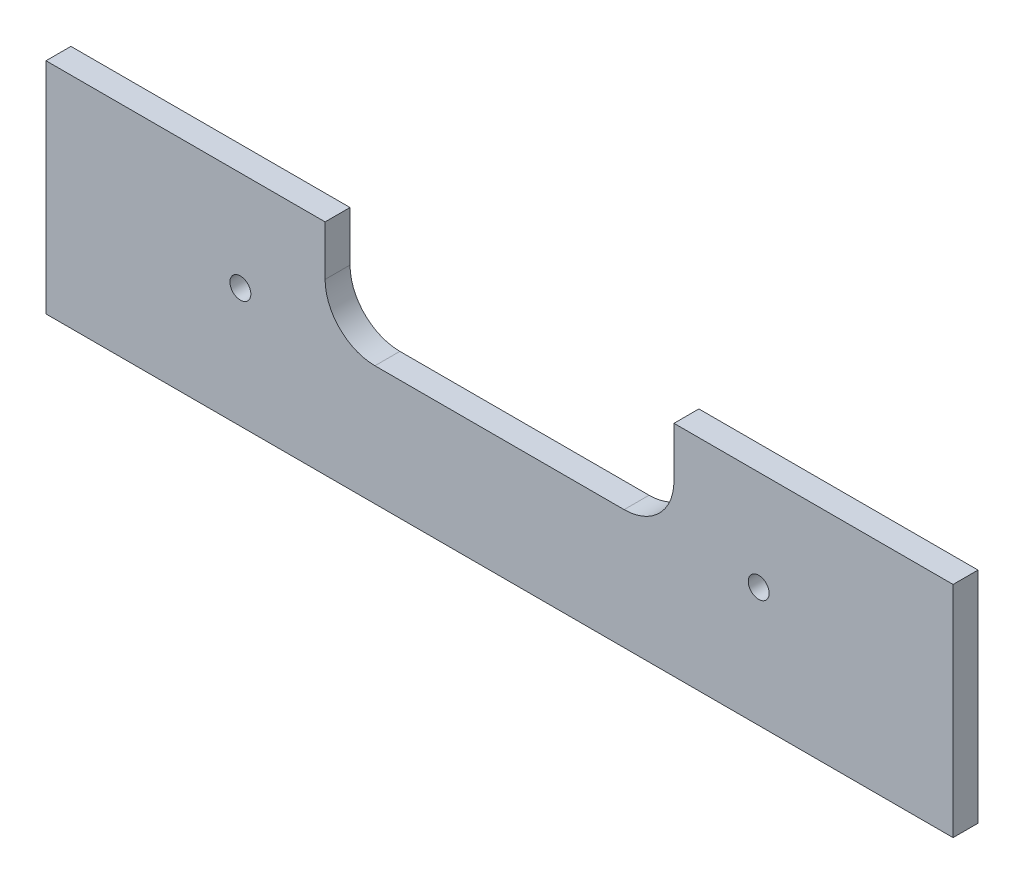
ISO-10303-21;
HEADER;
FILE_DESCRIPTION(('STEP AP214'),'2;1');
FILE_NAME('part.step','',(''),(''),'','','');
FILE_SCHEMA(('AUTOMOTIVE_DESIGN { 1 0 10303 214 1 1 1 1 }'));
ENDSEC;
DATA;
#1=APPLICATION_CONTEXT('core data for automotive mechanical design processes');
#2=APPLICATION_PROTOCOL_DEFINITION('international standard','automotive_design',2000,#1);
#3=PRODUCT_CONTEXT('',#1,'mechanical');
#4=PRODUCT('Part','Part','',(#3));
#5=PRODUCT_RELATED_PRODUCT_CATEGORY('part','',(#4));
#6=PRODUCT_DEFINITION_FORMATION('','',#4);
#7=PRODUCT_DEFINITION_CONTEXT('part definition',#1,'design');
#8=PRODUCT_DEFINITION('design','',#6,#7);
#9=PRODUCT_DEFINITION_SHAPE('','',#8);
#10=(LENGTH_UNIT() NAMED_UNIT(*) SI_UNIT(.MILLI.,.METRE.));
#11=(NAMED_UNIT(*) PLANE_ANGLE_UNIT() SI_UNIT($,.RADIAN.));
#12=(NAMED_UNIT(*) SI_UNIT($,.STERADIAN.) SOLID_ANGLE_UNIT());
#13=UNCERTAINTY_MEASURE_WITH_UNIT(LENGTH_MEASURE(1.E-05),#10,'distance_accuracy_value','');
#14=(GEOMETRIC_REPRESENTATION_CONTEXT(3) GLOBAL_UNCERTAINTY_ASSIGNED_CONTEXT((#13)) GLOBAL_UNIT_ASSIGNED_CONTEXT((#10,
#11,#12)) REPRESENTATION_CONTEXT('',''));
#15=CARTESIAN_POINT('',(0.,0.,0.));
#16=DIRECTION('',(0.,0.,1.));
#17=DIRECTION('',(1.,0.,0.));
#18=AXIS2_PLACEMENT_3D('',#15,#16,#17);
#19=CARTESIAN_POINT('',(91.,25.,5.));
#20=DIRECTION('',(0.,-1.,0.));
#21=DIRECTION('',(1.,0.,0.));
#22=AXIS2_PLACEMENT_3D('',#19,#20,#21);
#23=PLANE('',#22);
#24=DIRECTION('',(-1.,0.,0.));
#25=VECTOR('',#24,1.);
#26=CARTESIAN_POINT('',(91.,25.,5.));
#27=LINE('',#26,#25);
#28=CARTESIAN_POINT('',(-35.,25.,5.));
#29=VERTEX_POINT('',#28);
#30=CARTESIAN_POINT('',(-91.,25.,5.));
#31=VERTEX_POINT('',#30);
#32=EDGE_CURVE('E141',#29,#31,#27,.T.);
#33=ORIENTED_EDGE('',*,*,#32,.F.);
#34=DIRECTION('',(0.,0.,1.));
#35=VECTOR('',#34,1.);
#36=CARTESIAN_POINT('',(-35.,25.,-5.));
#37=LINE('',#36,#35);
#38=CARTESIAN_POINT('',(-35.,25.,0.));
#39=VERTEX_POINT('',#38);
#40=EDGE_CURVE('E131',#39,#29,#37,.T.);
#41=ORIENTED_EDGE('',*,*,#40,.F.);
#42=DIRECTION('',(-1.,0.,0.));
#43=VECTOR('',#42,1.);
#44=CARTESIAN_POINT('',(91.,25.,0.));
#45=LINE('',#44,#43);
#46=CARTESIAN_POINT('',(-91.,25.,0.));
#47=VERTEX_POINT('',#46);
#48=EDGE_CURVE('E155',#39,#47,#45,.T.);
#49=ORIENTED_EDGE('',*,*,#48,.T.);
#50=DIRECTION('',(0.,0.,-1.));
#51=VECTOR('',#50,1.);
#52=CARTESIAN_POINT('',(-91.,25.,5.));
#53=LINE('',#52,#51);
#54=EDGE_CURVE('E140',#31,#47,#53,.T.);
#55=ORIENTED_EDGE('',*,*,#54,.F.);
#56=EDGE_LOOP('',(#33,#41,#49,#55));
#57=FACE_BOUND('',#56,.T.);
#58=ADVANCED_FACE('F38',(#57),#23,.F.);
#59=CARTESIAN_POINT('',(-91.,-25.,5.));
#60=DIRECTION('',(1.,0.,0.));
#61=DIRECTION('',(0.,0.,-1.));
#62=AXIS2_PLACEMENT_3D('',#59,#60,#61);
#63=PLANE('',#62);
#64=DIRECTION('',(0.,-1.,0.));
#65=VECTOR('',#64,1.);
#66=CARTESIAN_POINT('',(-91.,-25.,0.));
#67=LINE('',#66,#65);
#68=CARTESIAN_POINT('',(-91.,-19.,0.));
#69=VERTEX_POINT('',#68);
#70=EDGE_CURVE('E149',#47,#69,#67,.T.);
#71=ORIENTED_EDGE('',*,*,#70,.T.);
#72=DIRECTION('',(0.,0.,1.));
#73=VECTOR('',#72,1.);
#74=CARTESIAN_POINT('',(-91.,-19.,-5.));
#75=LINE('',#74,#73);
#76=CARTESIAN_POINT('',(-91.,-19.,5.));
#77=VERTEX_POINT('',#76);
#78=EDGE_CURVE('E235',#69,#77,#75,.T.);
#79=ORIENTED_EDGE('',*,*,#78,.T.);
#80=DIRECTION('',(0.,-1.,0.));
#81=VECTOR('',#80,1.);
#82=CARTESIAN_POINT('',(-91.,-25.,5.));
#83=LINE('',#82,#81);
#84=EDGE_CURVE('E156',#31,#77,#83,.T.);
#85=ORIENTED_EDGE('',*,*,#84,.F.);
#86=ORIENTED_EDGE('',*,*,#54,.T.);
#87=EDGE_LOOP('',(#71,#79,#85,#86));
#88=FACE_BOUND('',#87,.T.);
#89=ADVANCED_FACE('F202',(#88),#63,.F.);
#90=CARTESIAN_POINT('',(91.,-25.,5.));
#91=DIRECTION('',(-1.,0.,0.));
#92=DIRECTION('',(0.,0.,1.));
#93=AXIS2_PLACEMENT_3D('',#90,#91,#92);
#94=PLANE('',#93);
#95=DIRECTION('',(0.,1.,0.));
#96=VECTOR('',#95,1.);
#97=CARTESIAN_POINT('',(91.,-25.,5.));
#98=LINE('',#97,#96);
#99=CARTESIAN_POINT('',(91.,-19.,5.));
#100=VERTEX_POINT('',#99);
#101=CARTESIAN_POINT('',(91.,25.,5.));
#102=VERTEX_POINT('',#101);
#103=EDGE_CURVE('E138',#100,#102,#98,.T.);
#104=ORIENTED_EDGE('',*,*,#103,.F.);
#105=DIRECTION('',(0.,0.,1.));
#106=VECTOR('',#105,1.);
#107=CARTESIAN_POINT('',(91.,-19.,-5.));
#108=LINE('',#107,#106);
#109=CARTESIAN_POINT('',(91.,-19.,0.));
#110=VERTEX_POINT('',#109);
#111=EDGE_CURVE('E225',#110,#100,#108,.T.);
#112=ORIENTED_EDGE('',*,*,#111,.F.);
#113=DIRECTION('',(0.,1.,0.));
#114=VECTOR('',#113,1.);
#115=CARTESIAN_POINT('',(91.,-25.,0.));
#116=LINE('',#115,#114);
#117=CARTESIAN_POINT('',(91.,25.,0.));
#118=VERTEX_POINT('',#117);
#119=EDGE_CURVE('E152',#110,#118,#116,.T.);
#120=ORIENTED_EDGE('',*,*,#119,.T.);
#121=DIRECTION('',(0.,0.,-1.));
#122=VECTOR('',#121,1.);
#123=CARTESIAN_POINT('',(91.,25.,5.));
#124=LINE('',#123,#122);
#125=EDGE_CURVE('E144',#102,#118,#124,.T.);
#126=ORIENTED_EDGE('',*,*,#125,.F.);
#127=EDGE_LOOP('',(#104,#112,#120,#126));
#128=FACE_BOUND('',#127,.T.);
#129=ADVANCED_FACE('F208',(#128),#94,.F.);
#130=CARTESIAN_POINT('',(35.,25.,0.));
#131=VERTEX_POINT('',#130);
#132=EDGE_CURVE('E130',#118,#131,#45,.T.);
#133=ORIENTED_EDGE('',*,*,#132,.T.);
#134=DIRECTION('',(0.,0.,1.));
#135=VECTOR('',#134,1.);
#136=CARTESIAN_POINT('',(35.,25.,-5.));
#137=LINE('',#136,#135);
#138=CARTESIAN_POINT('',(35.,25.,5.));
#139=VERTEX_POINT('',#138);
#140=EDGE_CURVE('E117',#131,#139,#137,.T.);
#141=ORIENTED_EDGE('',*,*,#140,.T.);
#142=EDGE_CURVE('E128',#102,#139,#27,.T.);
#143=ORIENTED_EDGE('',*,*,#142,.F.);
#144=ORIENTED_EDGE('',*,*,#125,.T.);
#145=EDGE_LOOP('',(#133,#141,#143,#144));
#146=FACE_BOUND('',#145,.T.);
#147=ADVANCED_FACE('F126',(#146),#23,.F.);
#148=CARTESIAN_POINT('',(0.,0.,5.));
#149=DIRECTION('',(0.,0.,1.));
#150=DIRECTION('',(1.,0.,0.));
#151=AXIS2_PLACEMENT_3D('',#148,#149,#150);
#152=PLANE('',#151);
#153=DIRECTION('',(0.,-1.,0.));
#154=VECTOR('',#153,1.);
#155=CARTESIAN_POINT('',(-35.,25.,5.));
#156=LINE('',#155,#154);
#157=CARTESIAN_POINT('',(-35.,15.,5.));
#158=VERTEX_POINT('',#157);
#159=EDGE_CURVE('E193',#29,#158,#156,.T.);
#160=ORIENTED_EDGE('',*,*,#159,.F.);
#161=ORIENTED_EDGE('',*,*,#32,.T.);
#162=ORIENTED_EDGE('',*,*,#84,.T.);
#163=DIRECTION('',(-1.,0.,0.));
#164=VECTOR('',#163,1.);
#165=CARTESIAN_POINT('',(-91.,-19.,5.));
#166=LINE('',#165,#164);
#167=EDGE_CURVE('E236',#100,#77,#166,.T.);
#168=ORIENTED_EDGE('',*,*,#167,.F.);
#169=ORIENTED_EDGE('',*,*,#103,.T.);
#170=ORIENTED_EDGE('',*,*,#142,.T.);
#171=DIRECTION('',(0.,1.,0.));
#172=VECTOR('',#171,1.);
#173=CARTESIAN_POINT('',(35.,25.,5.));
#174=LINE('',#173,#172);
#175=CARTESIAN_POINT('',(35.,15.,5.));
#176=VERTEX_POINT('',#175);
#177=EDGE_CURVE('E114',#176,#139,#174,.T.);
#178=ORIENTED_EDGE('',*,*,#177,.F.);
#179=CARTESIAN_POINT('',(25.,15.,5.));
#180=DIRECTION('',(0.,0.,1.));
#181=DIRECTION('',(1.,0.,0.));
#182=AXIS2_PLACEMENT_3D('',#179,#180,#181);
#183=CIRCLE('',#182,10.);
#184=CARTESIAN_POINT('',(25.,5.00000000000001,5.));
#185=VERTEX_POINT('',#184);
#186=EDGE_CURVE('E46',#176,#185,#183,.F.);
#187=ORIENTED_EDGE('',*,*,#186,.T.);
#188=DIRECTION('',(1.,0.,0.));
#189=VECTOR('',#188,1.);
#190=CARTESIAN_POINT('',(-35.,5.00000000000001,5.));
#191=LINE('',#190,#189);
#192=CARTESIAN_POINT('',(-25.,5.00000000000001,5.));
#193=VERTEX_POINT('',#192);
#194=EDGE_CURVE('E122',#193,#185,#191,.T.);
#195=ORIENTED_EDGE('',*,*,#194,.F.);
#196=CARTESIAN_POINT('',(-25.,15.,5.));
#197=DIRECTION('',(0.,0.,1.));
#198=DIRECTION('',(1.,0.,0.));
#199=AXIS2_PLACEMENT_3D('',#196,#197,#198);
#200=CIRCLE('',#199,10.);
#201=EDGE_CURVE('E184',#193,#158,#200,.F.);
#202=ORIENTED_EDGE('',*,*,#201,.T.);
#203=EDGE_LOOP('',(#160,#161,#162,#168,#169,#170,#178,#187,#195,#202));
#204=FACE_BOUND('',#203,.T.);
#205=CARTESIAN_POINT('',(-52.,5.00000000000001,5.));
#206=DIRECTION('',(0.,0.,1.));
#207=DIRECTION('',(1.,0.,0.));
#208=AXIS2_PLACEMENT_3D('',#205,#206,#207);
#209=CIRCLE('',#208,2.1);
#210=CARTESIAN_POINT('',(-49.9,5.00000000000001,5.));
#211=VERTEX_POINT('',#210);
#212=EDGE_CURVE('E166',#211,#211,#209,.T.);
#213=ORIENTED_EDGE('',*,*,#212,.F.);
#214=EDGE_LOOP('',(#213));
#215=FACE_BOUND('',#214,.T.);
#216=CARTESIAN_POINT('',(52.,5.00000000000001,5.));
#217=DIRECTION('',(0.,0.,1.));
#218=DIRECTION('',(1.,0.,0.));
#219=AXIS2_PLACEMENT_3D('',#216,#217,#218);
#220=CIRCLE('',#219,2.1);
#221=CARTESIAN_POINT('',(54.1,5.00000000000001,5.));
#222=VERTEX_POINT('',#221);
#223=EDGE_CURVE('E162',#222,#222,#220,.T.);
#224=ORIENTED_EDGE('',*,*,#223,.F.);
#225=EDGE_LOOP('',(#224));
#226=FACE_BOUND('',#225,.T.);
#227=ADVANCED_FACE('F134',(#204,#215,#226),#152,.T.);
#228=CARTESIAN_POINT('',(0.,0.,0.));
#229=DIRECTION('',(0.,0.,1.));
#230=DIRECTION('',(1.,0.,0.));
#231=AXIS2_PLACEMENT_3D('',#228,#229,#230);
#232=PLANE('',#231);
#233=ORIENTED_EDGE('',*,*,#48,.F.);
#234=DIRECTION('',(0.,-1.,0.));
#235=VECTOR('',#234,1.);
#236=CARTESIAN_POINT('',(-35.,0.,0.));
#237=LINE('',#236,#235);
#238=CARTESIAN_POINT('',(-35.,15.,0.));
#239=VERTEX_POINT('',#238);
#240=EDGE_CURVE('E173',#39,#239,#237,.T.);
#241=ORIENTED_EDGE('',*,*,#240,.T.);
#242=CARTESIAN_POINT('',(-25.,15.,0.));
#243=DIRECTION('',(0.,0.,1.));
#244=DIRECTION('',(1.,0.,0.));
#245=AXIS2_PLACEMENT_3D('',#242,#243,#244);
#246=CIRCLE('',#245,10.);
#247=CARTESIAN_POINT('',(-25.,5.00000000000001,0.));
#248=VERTEX_POINT('',#247);
#249=EDGE_CURVE('E186',#239,#248,#246,.T.);
#250=ORIENTED_EDGE('',*,*,#249,.T.);
#251=DIRECTION('',(1.,0.,0.));
#252=VECTOR('',#251,1.);
#253=CARTESIAN_POINT('',(0.,5.00000000000001,0.));
#254=LINE('',#253,#252);
#255=CARTESIAN_POINT('',(25.,5.00000000000001,0.));
#256=VERTEX_POINT('',#255);
#257=EDGE_CURVE('E169',#248,#256,#254,.T.);
#258=ORIENTED_EDGE('',*,*,#257,.T.);
#259=CARTESIAN_POINT('',(25.,15.,0.));
#260=DIRECTION('',(0.,0.,1.));
#261=DIRECTION('',(1.,0.,0.));
#262=AXIS2_PLACEMENT_3D('',#259,#260,#261);
#263=CIRCLE('',#262,10.);
#264=CARTESIAN_POINT('',(35.,15.,0.));
#265=VERTEX_POINT('',#264);
#266=EDGE_CURVE('E11',#256,#265,#263,.T.);
#267=ORIENTED_EDGE('',*,*,#266,.T.);
#268=DIRECTION('',(0.,1.,0.));
#269=VECTOR('',#268,1.);
#270=CARTESIAN_POINT('',(35.,0.,0.));
#271=LINE('',#270,#269);
#272=EDGE_CURVE('E171',#265,#131,#271,.T.);
#273=ORIENTED_EDGE('',*,*,#272,.T.);
#274=ORIENTED_EDGE('',*,*,#132,.F.);
#275=ORIENTED_EDGE('',*,*,#119,.F.);
#276=DIRECTION('',(-1.,0.,0.));
#277=VECTOR('',#276,1.);
#278=CARTESIAN_POINT('',(0.,-19.,0.));
#279=LINE('',#278,#277);
#280=EDGE_CURVE('E159',#110,#69,#279,.T.);
#281=ORIENTED_EDGE('',*,*,#280,.T.);
#282=ORIENTED_EDGE('',*,*,#70,.F.);
#283=EDGE_LOOP('',(#233,#241,#250,#258,#267,#273,#274,#275,#281,#282));
#284=FACE_BOUND('',#283,.T.);
#285=CARTESIAN_POINT('',(-52.,5.00000000000001,0.));
#286=DIRECTION('',(0.,0.,1.));
#287=DIRECTION('',(1.,0.,0.));
#288=AXIS2_PLACEMENT_3D('',#285,#286,#287);
#289=CIRCLE('',#288,2.1);
#290=CARTESIAN_POINT('',(-49.9,5.00000000000001,0.));
#291=VERTEX_POINT('',#290);
#292=EDGE_CURVE('E163',#291,#291,#289,.T.);
#293=ORIENTED_EDGE('',*,*,#292,.T.);
#294=EDGE_LOOP('',(#293));
#295=FACE_BOUND('',#294,.T.);
#296=CARTESIAN_POINT('',(52.,5.00000000000001,0.));
#297=DIRECTION('',(0.,0.,1.));
#298=DIRECTION('',(1.,0.,0.));
#299=AXIS2_PLACEMENT_3D('',#296,#297,#298);
#300=CIRCLE('',#299,2.1);
#301=CARTESIAN_POINT('',(54.1,5.00000000000001,0.));
#302=VERTEX_POINT('',#301);
#303=EDGE_CURVE('E153',#302,#302,#300,.T.);
#304=ORIENTED_EDGE('',*,*,#303,.T.);
#305=EDGE_LOOP('',(#304));
#306=FACE_BOUND('',#305,.T.);
#307=ADVANCED_FACE('F219',(#284,#295,#306),#232,.F.);
#308=CARTESIAN_POINT('',(52.,5.00000000000001,5.));
#309=DIRECTION('',(0.,0.,1.));
#310=DIRECTION('',(1.,0.,0.));
#311=AXIS2_PLACEMENT_3D('',#308,#309,#310);
#312=CYLINDRICAL_SURFACE('',#311,2.1);
#313=ORIENTED_EDGE('',*,*,#223,.T.);
#314=EDGE_LOOP('',(#313));
#315=FACE_BOUND('',#314,.T.);
#316=ORIENTED_EDGE('',*,*,#303,.F.);
#317=EDGE_LOOP('',(#316));
#318=FACE_BOUND('',#317,.T.);
#319=ADVANCED_FACE('F261',(#315,#318),#312,.F.);
#320=CARTESIAN_POINT('',(-52.,5.00000000000001,5.));
#321=DIRECTION('',(0.,0.,1.));
#322=DIRECTION('',(1.,0.,0.));
#323=AXIS2_PLACEMENT_3D('',#320,#321,#322);
#324=CYLINDRICAL_SURFACE('',#323,2.1);
#325=ORIENTED_EDGE('',*,*,#212,.T.);
#326=EDGE_LOOP('',(#325));
#327=FACE_BOUND('',#326,.T.);
#328=ORIENTED_EDGE('',*,*,#292,.F.);
#329=EDGE_LOOP('',(#328));
#330=FACE_BOUND('',#329,.T.);
#331=ADVANCED_FACE('F254',(#327,#330),#324,.F.);
#332=CARTESIAN_POINT('',(-91.,-19.,-5.));
#333=DIRECTION('',(0.,1.,0.));
#334=DIRECTION('',(0.,0.,1.));
#335=AXIS2_PLACEMENT_3D('',#332,#333,#334);
#336=PLANE('',#335);
#337=ORIENTED_EDGE('',*,*,#111,.T.);
#338=ORIENTED_EDGE('',*,*,#167,.T.);
#339=ORIENTED_EDGE('',*,*,#78,.F.);
#340=ORIENTED_EDGE('',*,*,#280,.F.);
#341=EDGE_LOOP('',(#337,#338,#339,#340));
#342=FACE_BOUND('',#341,.T.);
#343=ADVANCED_FACE('F252',(#342),#336,.F.);
#344=CARTESIAN_POINT('',(-35.,25.,-5.));
#345=DIRECTION('',(-1.,0.,0.));
#346=DIRECTION('',(0.,0.,1.));
#347=AXIS2_PLACEMENT_3D('',#344,#345,#346);
#348=PLANE('',#347);
#349=ORIENTED_EDGE('',*,*,#159,.T.);
#350=DIRECTION('',(0.,0.,1.));
#351=VECTOR('',#350,1.);
#352=CARTESIAN_POINT('',(-35.,15.,0.));
#353=LINE('',#352,#351);
#354=EDGE_CURVE('E181',#158,#239,#353,.F.);
#355=ORIENTED_EDGE('',*,*,#354,.T.);
#356=ORIENTED_EDGE('',*,*,#240,.F.);
#357=ORIENTED_EDGE('',*,*,#40,.T.);
#358=EDGE_LOOP('',(#349,#355,#356,#357));
#359=FACE_BOUND('',#358,.T.);
#360=ADVANCED_FACE('F244',(#359),#348,.F.);
#361=CARTESIAN_POINT('',(35.,25.,-5.));
#362=DIRECTION('',(1.,0.,0.));
#363=DIRECTION('',(0.,0.,-1.));
#364=AXIS2_PLACEMENT_3D('',#361,#362,#363);
#365=PLANE('',#364);
#366=ORIENTED_EDGE('',*,*,#272,.F.);
#367=DIRECTION('',(0.,0.,1.));
#368=VECTOR('',#367,1.);
#369=CARTESIAN_POINT('',(35.,15.,5.));
#370=LINE('',#369,#368);
#371=EDGE_CURVE('E119',#265,#176,#370,.T.);
#372=ORIENTED_EDGE('',*,*,#371,.T.);
#373=ORIENTED_EDGE('',*,*,#177,.T.);
#374=ORIENTED_EDGE('',*,*,#140,.F.);
#375=EDGE_LOOP('',(#366,#372,#373,#374));
#376=FACE_BOUND('',#375,.T.);
#377=ADVANCED_FACE('F116',(#376),#365,.F.);
#378=CARTESIAN_POINT('',(-35.,5.00000000000001,-5.));
#379=DIRECTION('',(0.,-1.,0.));
#380=DIRECTION('',(0.,0.,-1.));
#381=AXIS2_PLACEMENT_3D('',#378,#379,#380);
#382=PLANE('',#381);
#383=ORIENTED_EDGE('',*,*,#257,.F.);
#384=DIRECTION('',(0.,0.,1.));
#385=VECTOR('',#384,1.);
#386=CARTESIAN_POINT('',(-25.,5.00000000000001,5.));
#387=LINE('',#386,#385);
#388=EDGE_CURVE('E178',#248,#193,#387,.T.);
#389=ORIENTED_EDGE('',*,*,#388,.T.);
#390=ORIENTED_EDGE('',*,*,#194,.T.);
#391=DIRECTION('',(0.,0.,1.));
#392=VECTOR('',#391,1.);
#393=CARTESIAN_POINT('',(25.,5.00000000000001,0.));
#394=LINE('',#393,#392);
#395=EDGE_CURVE('E176',#185,#256,#394,.F.);
#396=ORIENTED_EDGE('',*,*,#395,.T.);
#397=EDGE_LOOP('',(#383,#389,#390,#396));
#398=FACE_BOUND('',#397,.T.);
#399=ADVANCED_FACE('F191',(#398),#382,.F.);
#400=CARTESIAN_POINT('',(-25.,15.,-5.));
#401=DIRECTION('',(0.,0.,-1.));
#402=DIRECTION('',(-1.,0.,0.));
#403=AXIS2_PLACEMENT_3D('',#400,#401,#402);
#404=CYLINDRICAL_SURFACE('',#403,10.);
#405=ORIENTED_EDGE('',*,*,#249,.F.);
#406=ORIENTED_EDGE('',*,*,#354,.F.);
#407=ORIENTED_EDGE('',*,*,#201,.F.);
#408=ORIENTED_EDGE('',*,*,#388,.F.);
#409=EDGE_LOOP('',(#405,#406,#407,#408));
#410=FACE_BOUND('',#409,.T.);
#411=ADVANCED_FACE('F196',(#410),#404,.F.);
#412=CARTESIAN_POINT('',(25.,15.,-5.));
#413=DIRECTION('',(0.,0.,-1.));
#414=DIRECTION('',(-1.,0.,0.));
#415=AXIS2_PLACEMENT_3D('',#412,#413,#414);
#416=CYLINDRICAL_SURFACE('',#415,10.);
#417=ORIENTED_EDGE('',*,*,#266,.F.);
#418=ORIENTED_EDGE('',*,*,#395,.F.);
#419=ORIENTED_EDGE('',*,*,#186,.F.);
#420=ORIENTED_EDGE('',*,*,#371,.F.);
#421=EDGE_LOOP('',(#417,#418,#419,#420));
#422=FACE_BOUND('',#421,.T.);
#423=ADVANCED_FACE('F40',(#422),#416,.F.);
#424=CLOSED_SHELL('',(#58,#89,#129,#147,#227,#307,#319,#331,#343,#360,#377,#399,#411,#423));
#425=MANIFOLD_SOLID_BREP('B2',#424);
#426=ADVANCED_BREP_SHAPE_REPRESENTATION('',(#18,#425),#14);
#427=SHAPE_DEFINITION_REPRESENTATION(#9,#426);
ENDSEC;
END-ISO-10303-21;
